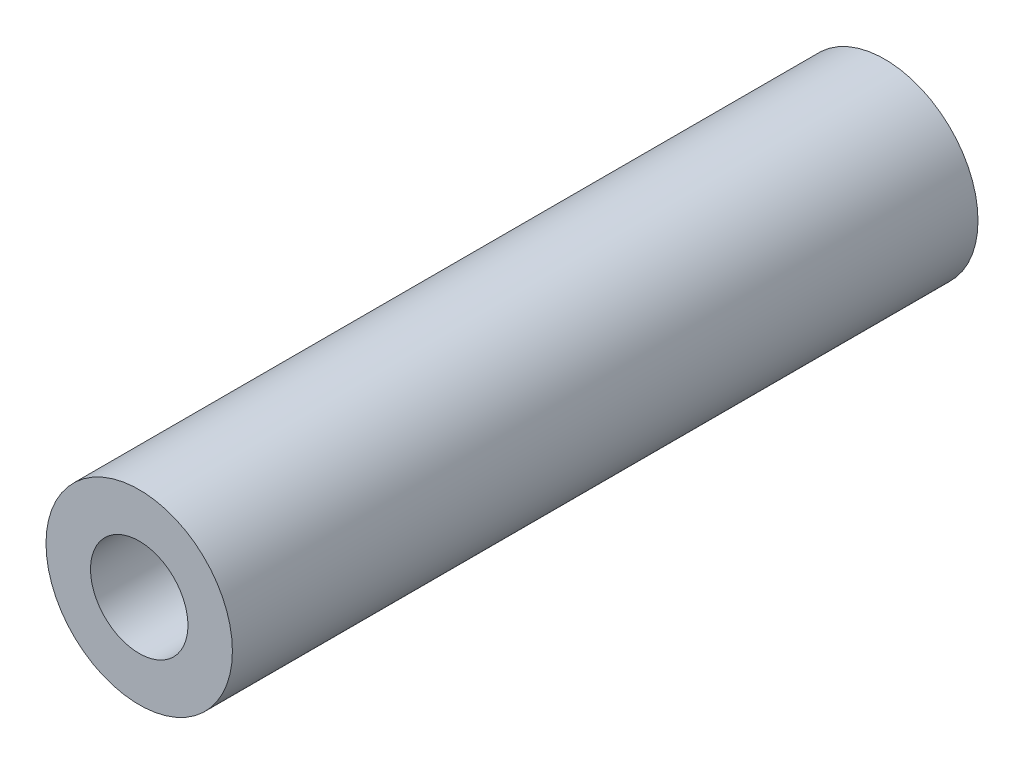
ISO-10303-21;
HEADER;
FILE_DESCRIPTION(('STEP AP214'),'2;1');
FILE_NAME('part.step','',(''),(''),'','','');
FILE_SCHEMA(('AUTOMOTIVE_DESIGN { 1 0 10303 214 1 1 1 1 }'));
ENDSEC;
DATA;
#1=APPLICATION_CONTEXT('core data for automotive mechanical design processes');
#2=APPLICATION_PROTOCOL_DEFINITION('international standard','automotive_design',2000,#1);
#3=PRODUCT_CONTEXT('',#1,'mechanical');
#4=PRODUCT('Part','Part','',(#3));
#5=PRODUCT_RELATED_PRODUCT_CATEGORY('part','',(#4));
#6=PRODUCT_DEFINITION_FORMATION('','',#4);
#7=PRODUCT_DEFINITION_CONTEXT('part definition',#1,'design');
#8=PRODUCT_DEFINITION('design','',#6,#7);
#9=PRODUCT_DEFINITION_SHAPE('','',#8);
#10=(LENGTH_UNIT() NAMED_UNIT(*) SI_UNIT(.MILLI.,.METRE.));
#11=(NAMED_UNIT(*) PLANE_ANGLE_UNIT() SI_UNIT($,.RADIAN.));
#12=(NAMED_UNIT(*) SI_UNIT($,.STERADIAN.) SOLID_ANGLE_UNIT());
#13=UNCERTAINTY_MEASURE_WITH_UNIT(LENGTH_MEASURE(1.E-05),#10,'distance_accuracy_value','');
#14=(GEOMETRIC_REPRESENTATION_CONTEXT(3) GLOBAL_UNCERTAINTY_ASSIGNED_CONTEXT((#13)) GLOBAL_UNIT_ASSIGNED_CONTEXT((#10,
#11,#12)) REPRESENTATION_CONTEXT('',''));
#15=CARTESIAN_POINT('',(0.,0.,0.));
#16=DIRECTION('',(0.,0.,1.));
#17=DIRECTION('',(1.,0.,0.));
#18=AXIS2_PLACEMENT_3D('',#15,#16,#17);
#19=CARTESIAN_POINT('',(0.,0.,38.1));
#20=DIRECTION('',(0.,0.,1.));
#21=DIRECTION('',(1.,0.,0.));
#22=AXIS2_PLACEMENT_3D('',#19,#20,#21);
#23=PLANE('',#22);
#24=CARTESIAN_POINT('',(0.,0.,38.1));
#25=DIRECTION('',(0.,0.,1.));
#26=DIRECTION('',(1.,0.,0.));
#27=AXIS2_PLACEMENT_3D('',#24,#25,#26);
#28=CIRCLE('',#27,4.7625);
#29=CARTESIAN_POINT('',(-4.7625,0.,38.1));
#30=VERTEX_POINT('',#29);
#31=EDGE_CURVE('E10',#30,#30,#28,.T.);
#32=ORIENTED_EDGE('',*,*,#31,.T.);
#33=EDGE_LOOP('',(#32));
#34=FACE_BOUND('',#33,.T.);
#35=CARTESIAN_POINT('',(0.,0.,38.1));
#36=DIRECTION('',(0.,0.,1.));
#37=DIRECTION('',(1.,0.,0.));
#38=AXIS2_PLACEMENT_3D('',#35,#36,#37);
#39=CIRCLE('',#38,2.4892);
#40=CARTESIAN_POINT('',(-2.4892,0.,38.1));
#41=VERTEX_POINT('',#40);
#42=EDGE_CURVE('E56',#41,#41,#39,.T.);
#43=ORIENTED_EDGE('',*,*,#42,.F.);
#44=EDGE_LOOP('',(#43));
#45=FACE_BOUND('',#44,.T.);
#46=ADVANCED_FACE('F43',(#34,#45),#23,.T.);
#47=CARTESIAN_POINT('',(0.,0.,0.));
#48=DIRECTION('',(0.,0.,1.));
#49=DIRECTION('',(1.,0.,0.));
#50=AXIS2_PLACEMENT_3D('',#47,#48,#49);
#51=PLANE('',#50);
#52=CARTESIAN_POINT('',(0.,0.,0.));
#53=DIRECTION('',(0.,0.,1.));
#54=DIRECTION('',(1.,0.,0.));
#55=AXIS2_PLACEMENT_3D('',#52,#53,#54);
#56=CIRCLE('',#55,4.7625);
#57=CARTESIAN_POINT('',(-4.7625,0.,0.));
#58=VERTEX_POINT('',#57);
#59=EDGE_CURVE('E47',#58,#58,#56,.T.);
#60=ORIENTED_EDGE('',*,*,#59,.F.);
#61=EDGE_LOOP('',(#60));
#62=FACE_BOUND('',#61,.T.);
#63=CARTESIAN_POINT('',(0.,0.,0.));
#64=DIRECTION('',(0.,0.,1.));
#65=DIRECTION('',(1.,0.,0.));
#66=AXIS2_PLACEMENT_3D('',#63,#64,#65);
#67=CIRCLE('',#66,2.4892);
#68=CARTESIAN_POINT('',(-2.4892,0.,0.));
#69=VERTEX_POINT('',#68);
#70=EDGE_CURVE('E58',#69,#69,#67,.T.);
#71=ORIENTED_EDGE('',*,*,#70,.T.);
#72=EDGE_LOOP('',(#71));
#73=FACE_BOUND('',#72,.T.);
#74=ADVANCED_FACE('F70',(#62,#73),#51,.F.);
#75=CARTESIAN_POINT('',(0.,0.,38.1));
#76=DIRECTION('',(0.,0.,-1.));
#77=DIRECTION('',(-1.,0.,0.));
#78=AXIS2_PLACEMENT_3D('',#75,#76,#77);
#79=CYLINDRICAL_SURFACE('',#78,4.7625);
#80=CARTESIAN_POINT('',(-4.7625,0.,38.1));
#81=CARTESIAN_POINT('',(-4.7625,0.,37.703125));
#82=CARTESIAN_POINT('',(-4.7625,0.,37.30625));
#83=CARTESIAN_POINT('',(-4.7625,0.,36.5125));
#84=CARTESIAN_POINT('',(-4.7625,0.,36.115625));
#85=CARTESIAN_POINT('',(-4.7625,0.,35.321875));
#86=CARTESIAN_POINT('',(-4.7625,0.,34.925));
#87=CARTESIAN_POINT('',(-4.7625,0.,34.13125));
#88=CARTESIAN_POINT('',(-4.7625,0.,33.734375));
#89=CARTESIAN_POINT('',(-4.7625,0.,32.940625));
#90=CARTESIAN_POINT('',(-4.7625,0.,32.54375));
#91=CARTESIAN_POINT('',(-4.7625,0.,31.75));
#92=CARTESIAN_POINT('',(-4.7625,0.,31.353125));
#93=CARTESIAN_POINT('',(-4.7625,0.,30.559375));
#94=CARTESIAN_POINT('',(-4.7625,0.,30.1625));
#95=CARTESIAN_POINT('',(-4.7625,0.,29.36875));
#96=CARTESIAN_POINT('',(-4.7625,0.,28.971875));
#97=CARTESIAN_POINT('',(-4.7625,0.,28.178125));
#98=CARTESIAN_POINT('',(-4.7625,0.,27.78125));
#99=CARTESIAN_POINT('',(-4.7625,0.,26.9875));
#100=CARTESIAN_POINT('',(-4.7625,0.,26.590625));
#101=CARTESIAN_POINT('',(-4.7625,0.,25.796875));
#102=CARTESIAN_POINT('',(-4.7625,0.,25.4));
#103=CARTESIAN_POINT('',(-4.7625,0.,24.60625));
#104=CARTESIAN_POINT('',(-4.7625,0.,24.209375));
#105=CARTESIAN_POINT('',(-4.7625,0.,23.415625));
#106=CARTESIAN_POINT('',(-4.7625,0.,23.01875));
#107=CARTESIAN_POINT('',(-4.7625,0.,22.225));
#108=CARTESIAN_POINT('',(-4.7625,0.,21.828125));
#109=CARTESIAN_POINT('',(-4.7625,0.,21.034375));
#110=CARTESIAN_POINT('',(-4.7625,0.,20.6375));
#111=CARTESIAN_POINT('',(-4.7625,0.,19.84375));
#112=CARTESIAN_POINT('',(-4.7625,0.,19.446875));
#113=CARTESIAN_POINT('',(-4.7625,0.,18.653125));
#114=CARTESIAN_POINT('',(-4.7625,0.,18.25625));
#115=CARTESIAN_POINT('',(-4.7625,0.,17.4625));
#116=CARTESIAN_POINT('',(-4.7625,0.,17.065625));
#117=CARTESIAN_POINT('',(-4.7625,0.,16.271875));
#118=CARTESIAN_POINT('',(-4.7625,0.,15.875));
#119=CARTESIAN_POINT('',(-4.7625,0.,15.08125));
#120=CARTESIAN_POINT('',(-4.7625,0.,14.684375));
#121=CARTESIAN_POINT('',(-4.7625,0.,13.890625));
#122=CARTESIAN_POINT('',(-4.7625,0.,13.49375));
#123=CARTESIAN_POINT('',(-4.7625,0.,12.7));
#124=CARTESIAN_POINT('',(-4.7625,0.,12.303125));
#125=CARTESIAN_POINT('',(-4.7625,0.,11.509375));
#126=CARTESIAN_POINT('',(-4.7625,0.,11.1125));
#127=CARTESIAN_POINT('',(-4.7625,0.,10.31875));
#128=CARTESIAN_POINT('',(-4.7625,0.,9.92187499999999));
#129=CARTESIAN_POINT('',(-4.7625,0.,9.128125));
#130=CARTESIAN_POINT('',(-4.7625,0.,8.73124999999999));
#131=CARTESIAN_POINT('',(-4.7625,0.,7.93749999999999));
#132=CARTESIAN_POINT('',(-4.7625,0.,7.54062499999999));
#133=CARTESIAN_POINT('',(-4.7625,0.,6.746875));
#134=CARTESIAN_POINT('',(-4.7625,0.,6.35));
#135=CARTESIAN_POINT('',(-4.7625,0.,5.55625));
#136=CARTESIAN_POINT('',(-4.7625,0.,5.159375));
#137=CARTESIAN_POINT('',(-4.7625,0.,4.365625));
#138=CARTESIAN_POINT('',(-4.7625,0.,3.96875));
#139=CARTESIAN_POINT('',(-4.7625,0.,3.175));
#140=CARTESIAN_POINT('',(-4.7625,0.,2.778125));
#141=CARTESIAN_POINT('',(-4.7625,0.,1.984375));
#142=CARTESIAN_POINT('',(-4.7625,0.,1.5875));
#143=CARTESIAN_POINT('',(-4.7625,0.,0.79375));
#144=CARTESIAN_POINT('',(-4.7625,0.,0.396875));
#145=CARTESIAN_POINT('',(-4.7625,0.,0.));
#146=B_SPLINE_CURVE_WITH_KNOTS('',3,(#80,#81,#82,#83,#84,#85,#86,#87,#88,#89,#90,#91,#92,#93,
#94,#95,#96,#97,#98,#99,#100,#101,#102,#103,#104,#105,#106,#107,#108,#109,#110,#111,#112,#113,
#114,#115,#116,#117,#118,#119,#120,#121,#122,#123,#124,#125,#126,#127,#128,#129,#130,#131,#132,
#133,#134,#135,#136,#137,#138,#139,#140,#141,#142,#143,#144,#145),.UNSPECIFIED.,.F.,.F.,(4,2,2,
2,2,2,2,2,2,2,2,2,2,2,2,2,2,2,2,2,2,2,2,2,2,2,2,2,2,2,2,2,4),(0.,1.190625,2.38125,3.571875,
4.7625,5.953125,7.14375,8.334375,9.52500000000001,10.715625,11.90625,13.096875,14.2875,
15.478125,16.66875,17.859375,19.05,20.240625,21.43125,22.621875,23.8125,25.003125,26.19375,
27.384375,28.575,29.765625,30.95625,32.146875,33.3375,34.528125,35.71875,36.909375,38.1),.UNSPECIFIED.);
#147=EDGE_CURVE('BSEAM45',#30,#58,#146,.T.);
#148=ORIENTED_EDGE('',*,*,#31,.F.);
#149=ORIENTED_EDGE('',*,*,#59,.T.);
#150=ORIENTED_EDGE('',*,*,#147,.T.);
#151=ORIENTED_EDGE('',*,*,#147,.F.);
#152=EDGE_LOOP('',(#148,#150,#149,#151));
#153=FACE_BOUND('',#152,.T.);
#154=ADVANCED_FACE('F45',(#153),#79,.T.);
#155=CARTESIAN_POINT('',(0.,0.,38.1));
#156=DIRECTION('',(0.,0.,-1.));
#157=DIRECTION('',(-1.,0.,0.));
#158=AXIS2_PLACEMENT_3D('',#155,#156,#157);
#159=CYLINDRICAL_SURFACE('',#158,2.4892);
#160=CARTESIAN_POINT('',(-2.4892,0.,38.1));
#161=CARTESIAN_POINT('',(-2.4892,0.,37.703125));
#162=CARTESIAN_POINT('',(-2.4892,0.,37.30625));
#163=CARTESIAN_POINT('',(-2.4892,0.,36.5125));
#164=CARTESIAN_POINT('',(-2.4892,0.,36.115625));
#165=CARTESIAN_POINT('',(-2.4892,0.,35.321875));
#166=CARTESIAN_POINT('',(-2.4892,0.,34.925));
#167=CARTESIAN_POINT('',(-2.4892,0.,34.13125));
#168=CARTESIAN_POINT('',(-2.4892,0.,33.734375));
#169=CARTESIAN_POINT('',(-2.4892,0.,32.940625));
#170=CARTESIAN_POINT('',(-2.4892,0.,32.54375));
#171=CARTESIAN_POINT('',(-2.4892,0.,31.75));
#172=CARTESIAN_POINT('',(-2.4892,0.,31.353125));
#173=CARTESIAN_POINT('',(-2.4892,0.,30.559375));
#174=CARTESIAN_POINT('',(-2.4892,0.,30.1625));
#175=CARTESIAN_POINT('',(-2.4892,0.,29.36875));
#176=CARTESIAN_POINT('',(-2.4892,0.,28.971875));
#177=CARTESIAN_POINT('',(-2.4892,0.,28.178125));
#178=CARTESIAN_POINT('',(-2.4892,0.,27.78125));
#179=CARTESIAN_POINT('',(-2.4892,0.,26.9875));
#180=CARTESIAN_POINT('',(-2.4892,0.,26.590625));
#181=CARTESIAN_POINT('',(-2.4892,0.,25.796875));
#182=CARTESIAN_POINT('',(-2.4892,0.,25.4));
#183=CARTESIAN_POINT('',(-2.4892,0.,24.60625));
#184=CARTESIAN_POINT('',(-2.4892,0.,24.209375));
#185=CARTESIAN_POINT('',(-2.4892,0.,23.415625));
#186=CARTESIAN_POINT('',(-2.4892,0.,23.01875));
#187=CARTESIAN_POINT('',(-2.4892,0.,22.225));
#188=CARTESIAN_POINT('',(-2.4892,0.,21.828125));
#189=CARTESIAN_POINT('',(-2.4892,0.,21.034375));
#190=CARTESIAN_POINT('',(-2.4892,0.,20.6375));
#191=CARTESIAN_POINT('',(-2.4892,0.,19.84375));
#192=CARTESIAN_POINT('',(-2.4892,0.,19.446875));
#193=CARTESIAN_POINT('',(-2.4892,0.,18.653125));
#194=CARTESIAN_POINT('',(-2.4892,0.,18.25625));
#195=CARTESIAN_POINT('',(-2.4892,0.,17.4625));
#196=CARTESIAN_POINT('',(-2.4892,0.,17.065625));
#197=CARTESIAN_POINT('',(-2.4892,0.,16.271875));
#198=CARTESIAN_POINT('',(-2.4892,0.,15.875));
#199=CARTESIAN_POINT('',(-2.4892,0.,15.08125));
#200=CARTESIAN_POINT('',(-2.4892,0.,14.684375));
#201=CARTESIAN_POINT('',(-2.4892,0.,13.890625));
#202=CARTESIAN_POINT('',(-2.4892,0.,13.49375));
#203=CARTESIAN_POINT('',(-2.4892,0.,12.7));
#204=CARTESIAN_POINT('',(-2.4892,0.,12.303125));
#205=CARTESIAN_POINT('',(-2.4892,0.,11.509375));
#206=CARTESIAN_POINT('',(-2.4892,0.,11.1125));
#207=CARTESIAN_POINT('',(-2.4892,0.,10.31875));
#208=CARTESIAN_POINT('',(-2.4892,0.,9.92187499999999));
#209=CARTESIAN_POINT('',(-2.4892,0.,9.128125));
#210=CARTESIAN_POINT('',(-2.4892,0.,8.73124999999999));
#211=CARTESIAN_POINT('',(-2.4892,0.,7.93749999999999));
#212=CARTESIAN_POINT('',(-2.4892,0.,7.54062499999999));
#213=CARTESIAN_POINT('',(-2.4892,0.,6.746875));
#214=CARTESIAN_POINT('',(-2.4892,0.,6.35));
#215=CARTESIAN_POINT('',(-2.4892,0.,5.55625));
#216=CARTESIAN_POINT('',(-2.4892,0.,5.159375));
#217=CARTESIAN_POINT('',(-2.4892,0.,4.365625));
#218=CARTESIAN_POINT('',(-2.4892,0.,3.96875));
#219=CARTESIAN_POINT('',(-2.4892,0.,3.175));
#220=CARTESIAN_POINT('',(-2.4892,0.,2.778125));
#221=CARTESIAN_POINT('',(-2.4892,0.,1.984375));
#222=CARTESIAN_POINT('',(-2.4892,0.,1.5875));
#223=CARTESIAN_POINT('',(-2.4892,0.,0.79375));
#224=CARTESIAN_POINT('',(-2.4892,0.,0.396875));
#225=CARTESIAN_POINT('',(-2.4892,0.,0.));
#226=B_SPLINE_CURVE_WITH_KNOTS('',3,(#160,#161,#162,#163,#164,#165,#166,#167,#168,#169,#170,
#171,#172,#173,#174,#175,#176,#177,#178,#179,#180,#181,#182,#183,#184,#185,#186,#187,#188,#189,
#190,#191,#192,#193,#194,#195,#196,#197,#198,#199,#200,#201,#202,#203,#204,#205,#206,#207,#208,
#209,#210,#211,#212,#213,#214,#215,#216,#217,#218,#219,#220,#221,#222,#223,#224,#225),
.UNSPECIFIED.,.F.,.F.,(4,2,2,2,2,2,2,2,2,2,2,2,2,2,2,2,2,2,2,2,2,2,2,2,2,2,2,2,2,2,2,2,4),(0.,
1.190625,2.38125,3.571875,4.7625,5.953125,7.14375,8.334375,9.52500000000001,10.715625,11.90625,
13.096875,14.2875,15.478125,16.66875,17.859375,19.05,20.240625,21.43125,22.621875,23.8125,
25.003125,26.19375,27.384375,28.575,29.765625,30.95625,32.146875,33.3375,34.528125,35.71875,
36.909375,38.1),.UNSPECIFIED.);
#227=EDGE_CURVE('BSEAM66',#41,#69,#226,.T.);
#228=ORIENTED_EDGE('',*,*,#42,.T.);
#229=ORIENTED_EDGE('',*,*,#70,.F.);
#230=ORIENTED_EDGE('',*,*,#227,.T.);
#231=ORIENTED_EDGE('',*,*,#227,.F.);
#232=EDGE_LOOP('',(#228,#230,#229,#231));
#233=FACE_BOUND('',#232,.T.);
#234=ADVANCED_FACE('F66',(#233),#159,.F.);
#235=CLOSED_SHELL('',(#46,#74,#154,#234));
#236=MANIFOLD_SOLID_BREP('B2',#235);
#237=ADVANCED_BREP_SHAPE_REPRESENTATION('',(#18,#236),#14);
#238=SHAPE_DEFINITION_REPRESENTATION(#9,#237);
ENDSEC;
END-ISO-10303-21;
